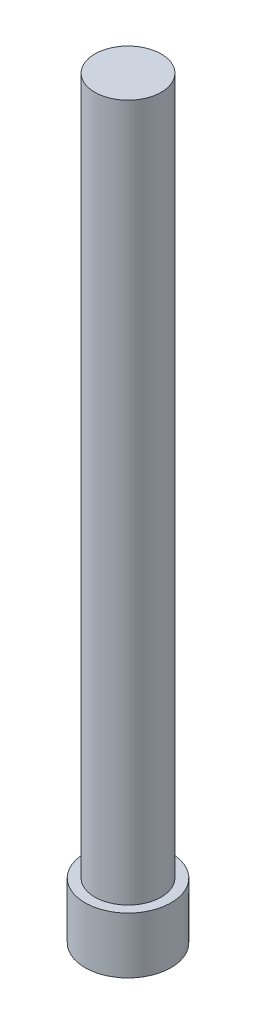
ISO-10303-21;
HEADER;
FILE_DESCRIPTION(('STEP AP214'),'2;1');
FILE_NAME('part.step','',(''),(''),'','','');
FILE_SCHEMA(('AUTOMOTIVE_DESIGN { 1 0 10303 214 1 1 1 1 }'));
ENDSEC;
DATA;
#1=APPLICATION_CONTEXT('core data for automotive mechanical design processes');
#2=APPLICATION_PROTOCOL_DEFINITION('international standard','automotive_design',2000,#1);
#3=PRODUCT_CONTEXT('',#1,'mechanical');
#4=PRODUCT('Part','Part','',(#3));
#5=PRODUCT_RELATED_PRODUCT_CATEGORY('part','',(#4));
#6=PRODUCT_DEFINITION_FORMATION('','',#4);
#7=PRODUCT_DEFINITION_CONTEXT('part definition',#1,'design');
#8=PRODUCT_DEFINITION('design','',#6,#7);
#9=PRODUCT_DEFINITION_SHAPE('','',#8);
#10=(LENGTH_UNIT() NAMED_UNIT(*) SI_UNIT(.MILLI.,.METRE.));
#11=(NAMED_UNIT(*) PLANE_ANGLE_UNIT() SI_UNIT($,.RADIAN.));
#12=(NAMED_UNIT(*) SI_UNIT($,.STERADIAN.) SOLID_ANGLE_UNIT());
#13=UNCERTAINTY_MEASURE_WITH_UNIT(LENGTH_MEASURE(1.E-05),#10,'distance_accuracy_value','');
#14=(GEOMETRIC_REPRESENTATION_CONTEXT(3) GLOBAL_UNCERTAINTY_ASSIGNED_CONTEXT((#13)) GLOBAL_UNIT_ASSIGNED_CONTEXT((#10,
#11,#12)) REPRESENTATION_CONTEXT('',''));
#15=CARTESIAN_POINT('',(0.,0.,0.));
#16=DIRECTION('',(0.,0.,1.));
#17=DIRECTION('',(1.,0.,0.));
#18=AXIS2_PLACEMENT_3D('',#15,#16,#17);
#19=CARTESIAN_POINT('',(0.,15.748,0.));
#20=DIRECTION('',(0.,-1.,0.));
#21=DIRECTION('',(0.,0.,-1.));
#22=AXIS2_PLACEMENT_3D('',#19,#20,#21);
#23=CYLINDRICAL_SURFACE('',#22,0.750000024);
#24=CARTESIAN_POINT('',(0.,15.748,0.));
#25=DIRECTION('',(0.,1.,0.));
#26=DIRECTION('',(0.,0.,1.));
#27=AXIS2_PLACEMENT_3D('',#24,#25,#26);
#28=CIRCLE('',#27,0.750000024);
#29=CARTESIAN_POINT('',(0.,15.748,0.750000024));
#30=VERTEX_POINT('',#29);
#31=EDGE_CURVE('E10',#30,#30,#28,.T.);
#32=ORIENTED_EDGE('',*,*,#31,.F.);
#33=EDGE_LOOP('',(#32));
#34=FACE_BOUND('',#33,.T.);
#35=CARTESIAN_POINT('',(0.,0.,0.));
#36=DIRECTION('',(0.,1.,0.));
#37=DIRECTION('',(0.,0.,1.));
#38=AXIS2_PLACEMENT_3D('',#35,#36,#37);
#39=CIRCLE('',#38,0.750000024);
#40=CARTESIAN_POINT('',(0.,0.,0.750000024));
#41=VERTEX_POINT('',#40);
#42=EDGE_CURVE('E44',#41,#41,#39,.T.);
#43=ORIENTED_EDGE('',*,*,#42,.T.);
#44=EDGE_LOOP('',(#43));
#45=FACE_BOUND('',#44,.T.);
#46=ADVANCED_FACE('F41',(#34,#45),#23,.T.);
#47=CARTESIAN_POINT('',(0.,15.748,0.));
#48=DIRECTION('',(0.,1.,0.));
#49=DIRECTION('',(0.,0.,1.));
#50=AXIS2_PLACEMENT_3D('',#47,#48,#49);
#51=PLANE('',#50);
#52=ORIENTED_EDGE('',*,*,#31,.T.);
#53=EDGE_LOOP('',(#52));
#54=FACE_BOUND('',#53,.T.);
#55=ADVANCED_FACE('F64',(#54),#51,.T.);
#56=CARTESIAN_POINT('',(0.,-1.27,0.));
#57=DIRECTION('',(0.,1.,0.));
#58=DIRECTION('',(0.,0.,1.));
#59=AXIS2_PLACEMENT_3D('',#56,#57,#58);
#60=CYLINDRICAL_SURFACE('',#59,0.971513933880657);
#61=CARTESIAN_POINT('',(0.,-1.27,0.));
#62=DIRECTION('',(0.,-1.,0.));
#63=DIRECTION('',(0.,0.,-1.));
#64=AXIS2_PLACEMENT_3D('',#61,#62,#63);
#65=CIRCLE('',#64,0.971513933880657);
#66=CARTESIAN_POINT('',(0.,-1.27,-0.971513933880657));
#67=VERTEX_POINT('',#66);
#68=EDGE_CURVE('E51',#67,#67,#65,.T.);
#69=ORIENTED_EDGE('',*,*,#68,.F.);
#70=EDGE_LOOP('',(#69));
#71=FACE_BOUND('',#70,.T.);
#72=CARTESIAN_POINT('',(0.,0.,0.));
#73=DIRECTION('',(0.,-1.,0.));
#74=DIRECTION('',(0.,0.,-1.));
#75=AXIS2_PLACEMENT_3D('',#72,#73,#74);
#76=CIRCLE('',#75,0.971513933880657);
#77=CARTESIAN_POINT('',(0.,0.,-0.971513933880657));
#78=VERTEX_POINT('',#77);
#79=EDGE_CURVE('E53',#78,#78,#76,.T.);
#80=ORIENTED_EDGE('',*,*,#79,.T.);
#81=EDGE_LOOP('',(#80));
#82=FACE_BOUND('',#81,.T.);
#83=ADVANCED_FACE('F61',(#71,#82),#60,.T.);
#84=CARTESIAN_POINT('',(0.,-1.27,0.));
#85=DIRECTION('',(0.,-1.,0.));
#86=DIRECTION('',(0.,0.,-1.));
#87=AXIS2_PLACEMENT_3D('',#84,#85,#86);
#88=PLANE('',#87);
#89=ORIENTED_EDGE('',*,*,#68,.T.);
#90=EDGE_LOOP('',(#89));
#91=FACE_BOUND('',#90,.T.);
#92=ADVANCED_FACE('F59',(#91),#88,.T.);
#93=CARTESIAN_POINT('',(0.,0.,0.));
#94=DIRECTION('',(0.,-1.,0.));
#95=DIRECTION('',(0.,0.,-1.));
#96=AXIS2_PLACEMENT_3D('',#93,#94,#95);
#97=PLANE('',#96);
#98=ORIENTED_EDGE('',*,*,#42,.F.);
#99=EDGE_LOOP('',(#98));
#100=FACE_BOUND('',#99,.T.);
#101=ORIENTED_EDGE('',*,*,#79,.F.);
#102=EDGE_LOOP('',(#101));
#103=FACE_BOUND('',#102,.T.);
#104=ADVANCED_FACE('F68',(#100,#103),#97,.F.);
#105=CLOSED_SHELL('',(#46,#55,#83,#92,#104));
#106=MANIFOLD_SOLID_BREP('B2',#105);
#107=ADVANCED_BREP_SHAPE_REPRESENTATION('',(#18,#106),#14);
#108=SHAPE_DEFINITION_REPRESENTATION(#9,#107);
ENDSEC;
END-ISO-10303-21;
